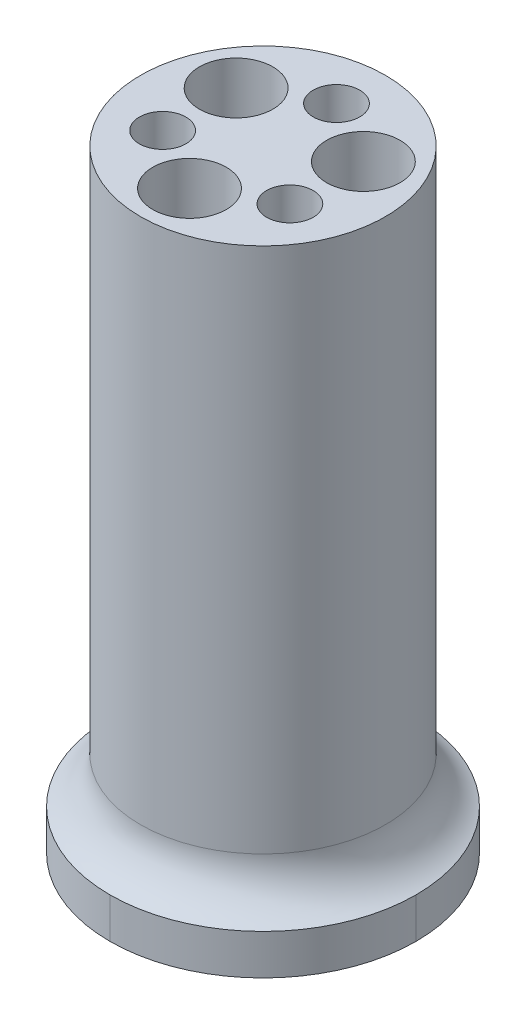
ISO-10303-21;
HEADER;
FILE_DESCRIPTION(('STEP AP214'),'2;1');
FILE_NAME('part.step','',(''),(''),'','','');
FILE_SCHEMA(('AUTOMOTIVE_DESIGN { 1 0 10303 214 1 1 1 1 }'));
ENDSEC;
DATA;
#1=APPLICATION_CONTEXT('core data for automotive mechanical design processes');
#2=APPLICATION_PROTOCOL_DEFINITION('international standard','automotive_design',2000,#1);
#3=PRODUCT_CONTEXT('',#1,'mechanical');
#4=PRODUCT('Part','Part','',(#3));
#5=PRODUCT_RELATED_PRODUCT_CATEGORY('part','',(#4));
#6=PRODUCT_DEFINITION_FORMATION('','',#4);
#7=PRODUCT_DEFINITION_CONTEXT('part definition',#1,'design');
#8=PRODUCT_DEFINITION('design','',#6,#7);
#9=PRODUCT_DEFINITION_SHAPE('','',#8);
#10=(LENGTH_UNIT() NAMED_UNIT(*) SI_UNIT(.MILLI.,.METRE.));
#11=(NAMED_UNIT(*) PLANE_ANGLE_UNIT() SI_UNIT($,.RADIAN.));
#12=(NAMED_UNIT(*) SI_UNIT($,.STERADIAN.) SOLID_ANGLE_UNIT());
#13=UNCERTAINTY_MEASURE_WITH_UNIT(LENGTH_MEASURE(1.E-05),#10,'distance_accuracy_value','');
#14=(GEOMETRIC_REPRESENTATION_CONTEXT(3) GLOBAL_UNCERTAINTY_ASSIGNED_CONTEXT((#13)) GLOBAL_UNIT_ASSIGNED_CONTEXT((#10,
#11,#12)) REPRESENTATION_CONTEXT('',''));
#15=CARTESIAN_POINT('',(0.,0.,0.));
#16=DIRECTION('',(0.,0.,1.));
#17=DIRECTION('',(1.,0.,0.));
#18=AXIS2_PLACEMENT_3D('',#15,#16,#17);
#19=CARTESIAN_POINT('',(0.,3.,0.));
#20=DIRECTION('',(0.,-1.,0.));
#21=DIRECTION('',(0.,0.,-1.));
#22=AXIS2_PLACEMENT_3D('',#19,#20,#21);
#23=CYLINDRICAL_SURFACE('',#22,12.5);
#24=DIRECTION('',(0.,-1.,0.));
#25=VECTOR('',#24,1.);
#26=CARTESIAN_POINT('',(0.,3.,-12.5));
#27=LINE('',#26,#25);
#28=CARTESIAN_POINT('',(0.,0.,-12.5));
#29=VERTEX_POINT('',#28);
#30=CARTESIAN_POINT('',(0.,3.29190075645217,-12.5));
#31=VERTEX_POINT('',#30);
#32=EDGE_CURVE('E123',#29,#31,#27,.F.);
#33=ORIENTED_EDGE('',*,*,#32,.T.);
#34=CARTESIAN_POINT('',(0.,3.29190075645216,0.));
#35=DIRECTION('',(0.,1.,0.));
#36=DIRECTION('',(0.,0.,1.));
#37=AXIS2_PLACEMENT_3D('',#34,#35,#36);
#38=CIRCLE('',#37,12.5);
#39=CARTESIAN_POINT('',(12.5,3.29190075645216,0.));
#40=VERTEX_POINT('',#39);
#41=EDGE_CURVE('E53',#40,#31,#38,.T.);
#42=ORIENTED_EDGE('',*,*,#41,.F.);
#43=DIRECTION('',(0.,-1.,0.));
#44=VECTOR('',#43,1.);
#45=CARTESIAN_POINT('',(12.5,3.,0.));
#46=LINE('',#45,#44);
#47=CARTESIAN_POINT('',(12.5,0.,0.));
#48=VERTEX_POINT('',#47);
#49=EDGE_CURVE('E94',#40,#48,#46,.T.);
#50=ORIENTED_EDGE('',*,*,#49,.T.);
#51=CARTESIAN_POINT('',(0.,0.,0.));
#52=DIRECTION('',(0.,1.,0.));
#53=DIRECTION('',(0.,0.,1.));
#54=AXIS2_PLACEMENT_3D('',#51,#52,#53);
#55=CIRCLE('',#54,12.5);
#56=EDGE_CURVE('E11',#29,#48,#55,.F.);
#57=ORIENTED_EDGE('',*,*,#56,.F.);
#58=EDGE_LOOP('',(#33,#42,#50,#57));
#59=FACE_BOUND('',#58,.T.);
#60=ADVANCED_FACE('F45',(#59),#23,.T.);
#61=CARTESIAN_POINT('',(0.,3.,0.));
#62=DIRECTION('',(0.,-1.,0.));
#63=DIRECTION('',(0.,0.,-1.));
#64=AXIS2_PLACEMENT_3D('',#61,#62,#63);
#65=CYLINDRICAL_SURFACE('',#64,12.5);
#66=DIRECTION('',(0.,-1.,0.));
#67=VECTOR('',#66,1.);
#68=CARTESIAN_POINT('',(-12.5,3.,0.));
#69=LINE('',#68,#67);
#70=CARTESIAN_POINT('',(-12.5,0.,0.));
#71=VERTEX_POINT('',#70);
#72=CARTESIAN_POINT('',(-12.5,3.29190075645217,0.));
#73=VERTEX_POINT('',#72);
#74=EDGE_CURVE('E98',#71,#73,#69,.F.);
#75=ORIENTED_EDGE('',*,*,#74,.T.);
#76=CARTESIAN_POINT('',(0.,3.29190075645217,0.));
#77=DIRECTION('',(0.,1.,0.));
#78=DIRECTION('',(0.,0.,1.));
#79=AXIS2_PLACEMENT_3D('',#76,#77,#78);
#80=CIRCLE('',#79,12.5);
#81=EDGE_CURVE('E126',#31,#73,#80,.T.);
#82=ORIENTED_EDGE('',*,*,#81,.F.);
#83=ORIENTED_EDGE('',*,*,#32,.F.);
#84=CARTESIAN_POINT('',(0.,0.,0.));
#85=DIRECTION('',(0.,1.,0.));
#86=DIRECTION('',(0.,0.,1.));
#87=AXIS2_PLACEMENT_3D('',#84,#85,#86);
#88=CIRCLE('',#87,12.5);
#89=EDGE_CURVE('E88',#71,#29,#88,.F.);
#90=ORIENTED_EDGE('',*,*,#89,.F.);
#91=EDGE_LOOP('',(#75,#82,#83,#90));
#92=FACE_BOUND('',#91,.T.);
#93=ADVANCED_FACE('F137',(#92),#65,.T.);
#94=CARTESIAN_POINT('',(0.,3.,0.));
#95=DIRECTION('',(0.,-1.,0.));
#96=DIRECTION('',(0.,0.,-1.));
#97=AXIS2_PLACEMENT_3D('',#94,#95,#96);
#98=CYLINDRICAL_SURFACE('',#97,12.5);
#99=DIRECTION('',(0.,-1.,0.));
#100=VECTOR('',#99,1.);
#101=CARTESIAN_POINT('',(0.,3.,12.5));
#102=LINE('',#101,#100);
#103=CARTESIAN_POINT('',(0.,0.,12.5));
#104=VERTEX_POINT('',#103);
#105=CARTESIAN_POINT('',(0.,3.29190075645217,12.5));
#106=VERTEX_POINT('',#105);
#107=EDGE_CURVE('E96',#104,#106,#102,.F.);
#108=ORIENTED_EDGE('',*,*,#107,.T.);
#109=CARTESIAN_POINT('',(0.,3.29190075645217,0.));
#110=DIRECTION('',(0.,1.,0.));
#111=DIRECTION('',(0.,0.,1.));
#112=AXIS2_PLACEMENT_3D('',#109,#110,#111);
#113=CIRCLE('',#112,12.5);
#114=EDGE_CURVE('E117',#73,#106,#113,.T.);
#115=ORIENTED_EDGE('',*,*,#114,.F.);
#116=ORIENTED_EDGE('',*,*,#74,.F.);
#117=CARTESIAN_POINT('',(0.,0.,0.));
#118=DIRECTION('',(0.,1.,0.));
#119=DIRECTION('',(0.,0.,1.));
#120=AXIS2_PLACEMENT_3D('',#117,#118,#119);
#121=CIRCLE('',#120,12.5);
#122=EDGE_CURVE('E120',#104,#71,#121,.F.);
#123=ORIENTED_EDGE('',*,*,#122,.F.);
#124=EDGE_LOOP('',(#108,#115,#116,#123));
#125=FACE_BOUND('',#124,.T.);
#126=ADVANCED_FACE('F136',(#125),#98,.T.);
#127=CARTESIAN_POINT('',(0.,3.,0.));
#128=DIRECTION('',(0.,-1.,0.));
#129=DIRECTION('',(0.,0.,-1.));
#130=AXIS2_PLACEMENT_3D('',#127,#128,#129);
#131=CYLINDRICAL_SURFACE('',#130,12.5);
#132=ORIENTED_EDGE('',*,*,#49,.F.);
#133=CARTESIAN_POINT('',(0.,3.29190075645217,0.));
#134=DIRECTION('',(0.,1.,0.));
#135=DIRECTION('',(0.,0.,1.));
#136=AXIS2_PLACEMENT_3D('',#133,#134,#135);
#137=CIRCLE('',#136,12.5);
#138=EDGE_CURVE('E99',#106,#40,#137,.T.);
#139=ORIENTED_EDGE('',*,*,#138,.F.);
#140=ORIENTED_EDGE('',*,*,#107,.F.);
#141=CARTESIAN_POINT('',(0.,0.,0.));
#142=DIRECTION('',(0.,1.,0.));
#143=DIRECTION('',(0.,0.,1.));
#144=AXIS2_PLACEMENT_3D('',#141,#142,#143);
#145=CIRCLE('',#144,12.5);
#146=EDGE_CURVE('E86',#48,#104,#145,.F.);
#147=ORIENTED_EDGE('',*,*,#146,.F.);
#148=EDGE_LOOP('',(#132,#139,#140,#147));
#149=FACE_BOUND('',#148,.T.);
#150=ADVANCED_FACE('F92',(#149),#131,.T.);
#151=CARTESIAN_POINT('',(0.,7.,0.));
#152=DIRECTION('',(0.,1.,0.));
#153=DIRECTION('',(0.,0.,1.));
#154=AXIS2_PLACEMENT_3D('',#151,#152,#153);
#155=TOROIDAL_SURFACE('',#154,14.,4.);
#156=CARTESIAN_POINT('',(0.,7.,0.));
#157=DIRECTION('',(0.,1.,0.));
#158=DIRECTION('',(0.,0.,1.));
#159=AXIS2_PLACEMENT_3D('',#156,#157,#158);
#160=CIRCLE('',#159,10.);
#161=CARTESIAN_POINT('',(0.,7.,10.));
#162=VERTEX_POINT('',#161);
#163=EDGE_CURVE('E102',#162,#162,#160,.T.);
#164=ORIENTED_EDGE('',*,*,#163,.F.);
#165=EDGE_LOOP('',(#164));
#166=FACE_BOUND('',#165,.T.);
#167=ORIENTED_EDGE('',*,*,#138,.T.);
#168=ORIENTED_EDGE('',*,*,#41,.T.);
#169=ORIENTED_EDGE('',*,*,#81,.T.);
#170=ORIENTED_EDGE('',*,*,#114,.T.);
#171=EDGE_LOOP('',(#167,#168,#169,#170));
#172=FACE_BOUND('',#171,.T.);
#173=ADVANCED_FACE('F132',(#166,#172),#155,.F.);
#174=CARTESIAN_POINT('',(0.,30.,0.));
#175=DIRECTION('',(0.,-1.,0.));
#176=DIRECTION('',(0.,0.,-1.));
#177=AXIS2_PLACEMENT_3D('',#174,#175,#176);
#178=CYLINDRICAL_SURFACE('',#177,10.);
#179=ORIENTED_EDGE('',*,*,#163,.T.);
#180=EDGE_LOOP('',(#179));
#181=FACE_BOUND('',#180,.T.);
#182=CARTESIAN_POINT('',(0.,50.,0.));
#183=DIRECTION('',(0.,1.,0.));
#184=DIRECTION('',(0.,0.,1.));
#185=AXIS2_PLACEMENT_3D('',#182,#183,#184);
#186=CIRCLE('',#185,10.);
#187=CARTESIAN_POINT('',(0.,50.,10.));
#188=VERTEX_POINT('',#187);
#189=EDGE_CURVE('E237',#188,#188,#186,.T.);
#190=ORIENTED_EDGE('',*,*,#189,.F.);
#191=EDGE_LOOP('',(#190));
#192=FACE_BOUND('',#191,.T.);
#193=ADVANCED_FACE('F149',(#181,#192),#178,.T.);
#194=CARTESIAN_POINT('',(0.,0.,0.));
#195=DIRECTION('',(0.,1.,0.));
#196=DIRECTION('',(0.,0.,1.));
#197=AXIS2_PLACEMENT_3D('',#194,#195,#196);
#198=PLANE('',#197);
#199=CARTESIAN_POINT('',(0.,0.,6.));
#200=DIRECTION('',(0.,-1.,0.));
#201=DIRECTION('',(0.,0.,-1.));
#202=AXIS2_PLACEMENT_3D('',#199,#200,#201);
#203=CIRCLE('',#202,1.6);
#204=CARTESIAN_POINT('',(0.,0.,4.4));
#205=VERTEX_POINT('',#204);
#206=EDGE_CURVE('E293',#205,#205,#203,.T.);
#207=ORIENTED_EDGE('',*,*,#206,.F.);
#208=EDGE_LOOP('',(#207));
#209=FACE_BOUND('',#208,.T.);
#210=CARTESIAN_POINT('',(5.19615242270664,0.,-2.99999999999999));
#211=DIRECTION('',(0.,-1.,0.));
#212=DIRECTION('',(0.,0.,-1.));
#213=AXIS2_PLACEMENT_3D('',#210,#211,#212);
#214=CIRCLE('',#213,1.6);
#215=CARTESIAN_POINT('',(5.19615242270664,0.,-4.59999999999999));
#216=VERTEX_POINT('',#215);
#217=EDGE_CURVE('E305',#216,#216,#214,.T.);
#218=ORIENTED_EDGE('',*,*,#217,.F.);
#219=EDGE_LOOP('',(#218));
#220=FACE_BOUND('',#219,.T.);
#221=CARTESIAN_POINT('',(-5.1961524227066,0.,-3.00000000000006));
#222=DIRECTION('',(0.,-1.,0.));
#223=DIRECTION('',(0.,0.,-1.));
#224=AXIS2_PLACEMENT_3D('',#221,#222,#223);
#225=CIRCLE('',#224,1.6);
#226=CARTESIAN_POINT('',(-5.1961524227066,0.,-4.60000000000006));
#227=VERTEX_POINT('',#226);
#228=EDGE_CURVE('E297',#227,#227,#225,.T.);
#229=ORIENTED_EDGE('',*,*,#228,.F.);
#230=EDGE_LOOP('',(#229));
#231=FACE_BOUND('',#230,.T.);
#232=ORIENTED_EDGE('',*,*,#89,.T.);
#233=ORIENTED_EDGE('',*,*,#56,.T.);
#234=ORIENTED_EDGE('',*,*,#146,.T.);
#235=ORIENTED_EDGE('',*,*,#122,.T.);
#236=EDGE_LOOP('',(#232,#233,#234,#235));
#237=FACE_BOUND('',#236,.T.);
#238=ADVANCED_FACE('F84',(#209,#220,#231,#237),#198,.F.);
#239=CARTESIAN_POINT('',(0.,15.,6.));
#240=DIRECTION('',(0.,-1.,0.));
#241=DIRECTION('',(0.,0.,-1.));
#242=AXIS2_PLACEMENT_3D('',#239,#240,#241);
#243=PLANE('',#242);
#244=CARTESIAN_POINT('',(0.,15.,6.));
#245=DIRECTION('',(0.,-1.,0.));
#246=DIRECTION('',(0.,0.,-1.));
#247=AXIS2_PLACEMENT_3D('',#244,#245,#246);
#248=CIRCLE('',#247,1.6);
#249=CARTESIAN_POINT('',(0.,15.,4.4));
#250=VERTEX_POINT('',#249);
#251=EDGE_CURVE('E108',#250,#250,#248,.T.);
#252=ORIENTED_EDGE('',*,*,#251,.T.);
#253=EDGE_LOOP('',(#252));
#254=FACE_BOUND('',#253,.T.);
#255=CARTESIAN_POINT('',(0.,15.,6.));
#256=DIRECTION('',(0.,1.,0.));
#257=DIRECTION('',(0.,0.,1.));
#258=AXIS2_PLACEMENT_3D('',#255,#256,#257);
#259=CIRCLE('',#258,3.);
#260=CARTESIAN_POINT('',(0.,15.,9.));
#261=VERTEX_POINT('',#260);
#262=EDGE_CURVE('E265',#261,#261,#259,.T.);
#263=ORIENTED_EDGE('',*,*,#262,.T.);
#264=EDGE_LOOP('',(#263));
#265=FACE_BOUND('',#264,.T.);
#266=ADVANCED_FACE('F156',(#254,#265),#243,.F.);
#267=CARTESIAN_POINT('',(0.,15.,6.));
#268=DIRECTION('',(0.,-1.,0.));
#269=DIRECTION('',(0.,0.,-1.));
#270=AXIS2_PLACEMENT_3D('',#267,#268,#269);
#271=CYLINDRICAL_SURFACE('',#270,1.6);
#272=ORIENTED_EDGE('',*,*,#251,.F.);
#273=EDGE_LOOP('',(#272));
#274=FACE_BOUND('',#273,.T.);
#275=ORIENTED_EDGE('',*,*,#206,.T.);
#276=EDGE_LOOP('',(#275));
#277=FACE_BOUND('',#276,.T.);
#278=ADVANCED_FACE('F166',(#274,#277),#271,.F.);
#279=CARTESIAN_POINT('',(5.19615242270664,15.,-2.99999999999999));
#280=DIRECTION('',(0.,-1.,0.));
#281=DIRECTION('',(0.,0.,-1.));
#282=AXIS2_PLACEMENT_3D('',#279,#280,#281);
#283=PLANE('',#282);
#284=CARTESIAN_POINT('',(5.19615242270664,15.,-2.99999999999999));
#285=DIRECTION('',(0.,-1.,0.));
#286=DIRECTION('',(0.,0.,-1.));
#287=AXIS2_PLACEMENT_3D('',#284,#285,#286);
#288=CIRCLE('',#287,1.6);
#289=CARTESIAN_POINT('',(5.19615242270664,15.,-4.59999999999999));
#290=VERTEX_POINT('',#289);
#291=EDGE_CURVE('E282',#290,#290,#288,.T.);
#292=ORIENTED_EDGE('',*,*,#291,.T.);
#293=EDGE_LOOP('',(#292));
#294=FACE_BOUND('',#293,.T.);
#295=CARTESIAN_POINT('',(5.19615242270664,15.,-2.99999999999999));
#296=DIRECTION('',(0.,1.,0.));
#297=DIRECTION('',(0.,0.,1.));
#298=AXIS2_PLACEMENT_3D('',#295,#296,#297);
#299=CIRCLE('',#298,3.);
#300=CARTESIAN_POINT('',(5.19615242270664,15.,0.));
#301=VERTEX_POINT('',#300);
#302=EDGE_CURVE('E266',#301,#301,#299,.T.);
#303=ORIENTED_EDGE('',*,*,#302,.T.);
#304=EDGE_LOOP('',(#303));
#305=FACE_BOUND('',#304,.T.);
#306=ADVANCED_FACE('F162',(#294,#305),#283,.F.);
#307=CARTESIAN_POINT('',(5.19615242270664,15.,-2.99999999999999));
#308=DIRECTION('',(0.,-1.,0.));
#309=DIRECTION('',(0.,0.,-1.));
#310=AXIS2_PLACEMENT_3D('',#307,#308,#309);
#311=CYLINDRICAL_SURFACE('',#310,1.6);
#312=ORIENTED_EDGE('',*,*,#291,.F.);
#313=EDGE_LOOP('',(#312));
#314=FACE_BOUND('',#313,.T.);
#315=ORIENTED_EDGE('',*,*,#217,.T.);
#316=EDGE_LOOP('',(#315));
#317=FACE_BOUND('',#316,.T.);
#318=ADVANCED_FACE('F158',(#314,#317),#311,.F.);
#319=CARTESIAN_POINT('',(-5.1961524227066,15.,-3.00000000000006));
#320=DIRECTION('',(0.,-1.,0.));
#321=DIRECTION('',(0.,0.,-1.));
#322=AXIS2_PLACEMENT_3D('',#319,#320,#321);
#323=PLANE('',#322);
#324=CARTESIAN_POINT('',(-5.1961524227066,15.,-3.00000000000006));
#325=DIRECTION('',(0.,-1.,0.));
#326=DIRECTION('',(0.,0.,-1.));
#327=AXIS2_PLACEMENT_3D('',#324,#325,#326);
#328=CIRCLE('',#327,1.6);
#329=CARTESIAN_POINT('',(-5.1961524227066,15.,-4.60000000000006));
#330=VERTEX_POINT('',#329);
#331=EDGE_CURVE('E301',#330,#330,#328,.T.);
#332=ORIENTED_EDGE('',*,*,#331,.T.);
#333=EDGE_LOOP('',(#332));
#334=FACE_BOUND('',#333,.T.);
#335=CARTESIAN_POINT('',(-5.1961524227066,15.,-3.00000000000006));
#336=DIRECTION('',(0.,1.,0.));
#337=DIRECTION('',(0.,0.,1.));
#338=AXIS2_PLACEMENT_3D('',#335,#336,#337);
#339=CIRCLE('',#338,3.);
#340=CARTESIAN_POINT('',(-5.1961524227066,15.,0.));
#341=VERTEX_POINT('',#340);
#342=EDGE_CURVE('E270',#341,#341,#339,.T.);
#343=ORIENTED_EDGE('',*,*,#342,.T.);
#344=EDGE_LOOP('',(#343));
#345=FACE_BOUND('',#344,.T.);
#346=ADVANCED_FACE('F161',(#334,#345),#323,.F.);
#347=CARTESIAN_POINT('',(-5.1961524227066,15.,-3.00000000000006));
#348=DIRECTION('',(0.,-1.,0.));
#349=DIRECTION('',(0.,0.,-1.));
#350=AXIS2_PLACEMENT_3D('',#347,#348,#349);
#351=CYLINDRICAL_SURFACE('',#350,1.6);
#352=ORIENTED_EDGE('',*,*,#331,.F.);
#353=EDGE_LOOP('',(#352));
#354=FACE_BOUND('',#353,.T.);
#355=ORIENTED_EDGE('',*,*,#228,.T.);
#356=EDGE_LOOP('',(#355));
#357=FACE_BOUND('',#356,.T.);
#358=ADVANCED_FACE('F168',(#354,#357),#351,.F.);
#359=CARTESIAN_POINT('',(-5.1961524227066,15.,-3.00000000000006));
#360=DIRECTION('',(0.,1.,0.));
#361=DIRECTION('',(0.,0.,1.));
#362=AXIS2_PLACEMENT_3D('',#359,#360,#361);
#363=CYLINDRICAL_SURFACE('',#362,3.);
#364=ORIENTED_EDGE('',*,*,#342,.F.);
#365=EDGE_LOOP('',(#364));
#366=FACE_BOUND('',#365,.T.);
#367=CARTESIAN_POINT('',(-5.1961524227066,50.,-3.00000000000006));
#368=DIRECTION('',(0.,1.,0.));
#369=DIRECTION('',(0.,0.,1.));
#370=AXIS2_PLACEMENT_3D('',#367,#368,#369);
#371=CIRCLE('',#370,3.);
#372=CARTESIAN_POINT('',(-5.1961524227066,50.,0.));
#373=VERTEX_POINT('',#372);
#374=EDGE_CURVE('E233',#373,#373,#371,.T.);
#375=ORIENTED_EDGE('',*,*,#374,.T.);
#376=EDGE_LOOP('',(#375));
#377=FACE_BOUND('',#376,.T.);
#378=ADVANCED_FACE('F171',(#366,#377),#363,.F.);
#379=CARTESIAN_POINT('',(5.19615242270664,15.,-2.99999999999999));
#380=DIRECTION('',(0.,1.,0.));
#381=DIRECTION('',(0.,0.,1.));
#382=AXIS2_PLACEMENT_3D('',#379,#380,#381);
#383=CYLINDRICAL_SURFACE('',#382,3.);
#384=ORIENTED_EDGE('',*,*,#302,.F.);
#385=EDGE_LOOP('',(#384));
#386=FACE_BOUND('',#385,.T.);
#387=CARTESIAN_POINT('',(5.19615242270664,50.,-2.99999999999999));
#388=DIRECTION('',(0.,1.,0.));
#389=DIRECTION('',(0.,0.,1.));
#390=AXIS2_PLACEMENT_3D('',#387,#388,#389);
#391=CIRCLE('',#390,3.);
#392=CARTESIAN_POINT('',(5.19615242270664,50.,0.));
#393=VERTEX_POINT('',#392);
#394=EDGE_CURVE('E229',#393,#393,#391,.T.);
#395=ORIENTED_EDGE('',*,*,#394,.T.);
#396=EDGE_LOOP('',(#395));
#397=FACE_BOUND('',#396,.T.);
#398=ADVANCED_FACE('F209',(#386,#397),#383,.F.);
#399=CARTESIAN_POINT('',(0.,15.,6.));
#400=DIRECTION('',(0.,1.,0.));
#401=DIRECTION('',(0.,0.,1.));
#402=AXIS2_PLACEMENT_3D('',#399,#400,#401);
#403=CYLINDRICAL_SURFACE('',#402,3.);
#404=ORIENTED_EDGE('',*,*,#262,.F.);
#405=EDGE_LOOP('',(#404));
#406=FACE_BOUND('',#405,.T.);
#407=CARTESIAN_POINT('',(0.,50.,6.));
#408=DIRECTION('',(0.,1.,0.));
#409=DIRECTION('',(0.,0.,1.));
#410=AXIS2_PLACEMENT_3D('',#407,#408,#409);
#411=CIRCLE('',#410,3.);
#412=CARTESIAN_POINT('',(0.,50.,9.));
#413=VERTEX_POINT('',#412);
#414=EDGE_CURVE('E245',#413,#413,#411,.T.);
#415=ORIENTED_EDGE('',*,*,#414,.T.);
#416=EDGE_LOOP('',(#415));
#417=FACE_BOUND('',#416,.T.);
#418=ADVANCED_FACE('F211',(#406,#417),#403,.F.);
#419=CARTESIAN_POINT('',(0.,50.,0.));
#420=DIRECTION('',(0.,1.,0.));
#421=DIRECTION('',(0.,0.,1.));
#422=AXIS2_PLACEMENT_3D('',#419,#420,#421);
#423=PLANE('',#422);
#424=CARTESIAN_POINT('',(5.19615242270662,50.,3.00000000000003));
#425=DIRECTION('',(0.,1.,0.));
#426=DIRECTION('',(0.,0.,1.));
#427=AXIS2_PLACEMENT_3D('',#424,#425,#426);
#428=CIRCLE('',#427,1.9);
#429=CARTESIAN_POINT('',(5.19615242270662,50.,4.90000000000003));
#430=VERTEX_POINT('',#429);
#431=EDGE_CURVE('E225',#430,#430,#428,.T.);
#432=ORIENTED_EDGE('',*,*,#431,.F.);
#433=EDGE_LOOP('',(#432));
#434=FACE_BOUND('',#433,.T.);
#435=ORIENTED_EDGE('',*,*,#394,.F.);
#436=EDGE_LOOP('',(#435));
#437=FACE_BOUND('',#436,.T.);
#438=ORIENTED_EDGE('',*,*,#374,.F.);
#439=EDGE_LOOP('',(#438));
#440=FACE_BOUND('',#439,.T.);
#441=ORIENTED_EDGE('',*,*,#189,.T.);
#442=EDGE_LOOP('',(#441));
#443=FACE_BOUND('',#442,.T.);
#444=CARTESIAN_POINT('',(0.,50.,-6.));
#445=DIRECTION('',(0.,1.,0.));
#446=DIRECTION('',(0.,0.,1.));
#447=AXIS2_PLACEMENT_3D('',#444,#445,#446);
#448=CIRCLE('',#447,1.9);
#449=CARTESIAN_POINT('',(0.,50.,-4.1));
#450=VERTEX_POINT('',#449);
#451=EDGE_CURVE('E241',#450,#450,#448,.T.);
#452=ORIENTED_EDGE('',*,*,#451,.F.);
#453=EDGE_LOOP('',(#452));
#454=FACE_BOUND('',#453,.T.);
#455=ORIENTED_EDGE('',*,*,#414,.F.);
#456=EDGE_LOOP('',(#455));
#457=FACE_BOUND('',#456,.T.);
#458=CARTESIAN_POINT('',(-5.19615242270666,50.,2.99999999999995));
#459=DIRECTION('',(0.,1.,0.));
#460=DIRECTION('',(0.,0.,1.));
#461=AXIS2_PLACEMENT_3D('',#458,#459,#460);
#462=CIRCLE('',#461,1.9);
#463=CARTESIAN_POINT('',(-5.19615242270666,50.,4.89999999999995));
#464=VERTEX_POINT('',#463);
#465=EDGE_CURVE('E248',#464,#464,#462,.T.);
#466=ORIENTED_EDGE('',*,*,#465,.F.);
#467=EDGE_LOOP('',(#466));
#468=FACE_BOUND('',#467,.T.);
#469=ADVANCED_FACE('F186',(#434,#437,#440,#443,#454,#457,#468),#423,.T.);
#470=CARTESIAN_POINT('',(5.19615242270662,20.,3.00000000000003));
#471=DIRECTION('',(0.,1.,0.));
#472=DIRECTION('',(0.,0.,1.));
#473=AXIS2_PLACEMENT_3D('',#470,#471,#472);
#474=PLANE('',#473);
#475=CARTESIAN_POINT('',(5.19615242270662,20.,3.00000000000003));
#476=DIRECTION('',(0.,1.,0.));
#477=DIRECTION('',(0.,0.,1.));
#478=AXIS2_PLACEMENT_3D('',#475,#476,#477);
#479=CIRCLE('',#478,1.9);
#480=CARTESIAN_POINT('',(5.19615242270662,20.,4.90000000000003));
#481=VERTEX_POINT('',#480);
#482=EDGE_CURVE('E277',#481,#481,#479,.T.);
#483=ORIENTED_EDGE('',*,*,#482,.T.);
#484=EDGE_LOOP('',(#483));
#485=FACE_BOUND('',#484,.T.);
#486=ADVANCED_FACE('F182',(#485),#474,.T.);
#487=CARTESIAN_POINT('',(5.19615242270662,20.,3.00000000000003));
#488=DIRECTION('',(0.,1.,0.));
#489=DIRECTION('',(0.,0.,1.));
#490=AXIS2_PLACEMENT_3D('',#487,#488,#489);
#491=CYLINDRICAL_SURFACE('',#490,1.9);
#492=ORIENTED_EDGE('',*,*,#482,.F.);
#493=EDGE_LOOP('',(#492));
#494=FACE_BOUND('',#493,.T.);
#495=ORIENTED_EDGE('',*,*,#431,.T.);
#496=EDGE_LOOP('',(#495));
#497=FACE_BOUND('',#496,.T.);
#498=ADVANCED_FACE('F185',(#494,#497),#491,.F.);
#499=CARTESIAN_POINT('',(-5.19615242270666,20.,2.99999999999995));
#500=DIRECTION('',(0.,1.,0.));
#501=DIRECTION('',(0.,0.,1.));
#502=AXIS2_PLACEMENT_3D('',#499,#500,#501);
#503=PLANE('',#502);
#504=CARTESIAN_POINT('',(-5.19615242270666,20.,2.99999999999995));
#505=DIRECTION('',(0.,1.,0.));
#506=DIRECTION('',(0.,0.,1.));
#507=AXIS2_PLACEMENT_3D('',#504,#505,#506);
#508=CIRCLE('',#507,1.9);
#509=CARTESIAN_POINT('',(-5.19615242270666,20.,4.89999999999995));
#510=VERTEX_POINT('',#509);
#511=EDGE_CURVE('E283',#510,#510,#508,.T.);
#512=ORIENTED_EDGE('',*,*,#511,.T.);
#513=EDGE_LOOP('',(#512));
#514=FACE_BOUND('',#513,.T.);
#515=ADVANCED_FACE('F190',(#514),#503,.T.);
#516=CARTESIAN_POINT('',(-5.19615242270666,20.,2.99999999999995));
#517=DIRECTION('',(0.,1.,0.));
#518=DIRECTION('',(0.,0.,1.));
#519=AXIS2_PLACEMENT_3D('',#516,#517,#518);
#520=CYLINDRICAL_SURFACE('',#519,1.9);
#521=ORIENTED_EDGE('',*,*,#511,.F.);
#522=EDGE_LOOP('',(#521));
#523=FACE_BOUND('',#522,.T.);
#524=ORIENTED_EDGE('',*,*,#465,.T.);
#525=EDGE_LOOP('',(#524));
#526=FACE_BOUND('',#525,.T.);
#527=ADVANCED_FACE('F194',(#523,#526),#520,.F.);
#528=CARTESIAN_POINT('',(0.,20.,-6.));
#529=DIRECTION('',(0.,1.,0.));
#530=DIRECTION('',(0.,0.,1.));
#531=AXIS2_PLACEMENT_3D('',#528,#529,#530);
#532=PLANE('',#531);
#533=CARTESIAN_POINT('',(0.,20.,-6.));
#534=DIRECTION('',(0.,1.,0.));
#535=DIRECTION('',(0.,0.,1.));
#536=AXIS2_PLACEMENT_3D('',#533,#534,#535);
#537=CIRCLE('',#536,1.9);
#538=CARTESIAN_POINT('',(0.,20.,-4.1));
#539=VERTEX_POINT('',#538);
#540=EDGE_CURVE('E278',#539,#539,#537,.T.);
#541=ORIENTED_EDGE('',*,*,#540,.T.);
#542=EDGE_LOOP('',(#541));
#543=FACE_BOUND('',#542,.T.);
#544=ADVANCED_FACE('F198',(#543),#532,.T.);
#545=CARTESIAN_POINT('',(0.,20.,-6.));
#546=DIRECTION('',(0.,1.,0.));
#547=DIRECTION('',(0.,0.,1.));
#548=AXIS2_PLACEMENT_3D('',#545,#546,#547);
#549=CYLINDRICAL_SURFACE('',#548,1.9);
#550=ORIENTED_EDGE('',*,*,#540,.F.);
#551=EDGE_LOOP('',(#550));
#552=FACE_BOUND('',#551,.T.);
#553=ORIENTED_EDGE('',*,*,#451,.T.);
#554=EDGE_LOOP('',(#553));
#555=FACE_BOUND('',#554,.T.);
#556=ADVANCED_FACE('F200',(#552,#555),#549,.F.);
#557=CLOSED_SHELL('',(#60,#93,#126,#150,#173,#193,#238,#266,#278,#306,#318,#346,#358,#378,#398,
#418,#469,#486,#498,#515,#527,#544,#556));
#558=MANIFOLD_SOLID_BREP('B2',#557);
#559=ADVANCED_BREP_SHAPE_REPRESENTATION('',(#18,#558),#14);
#560=SHAPE_DEFINITION_REPRESENTATION(#9,#559);
ENDSEC;
END-ISO-10303-21;
